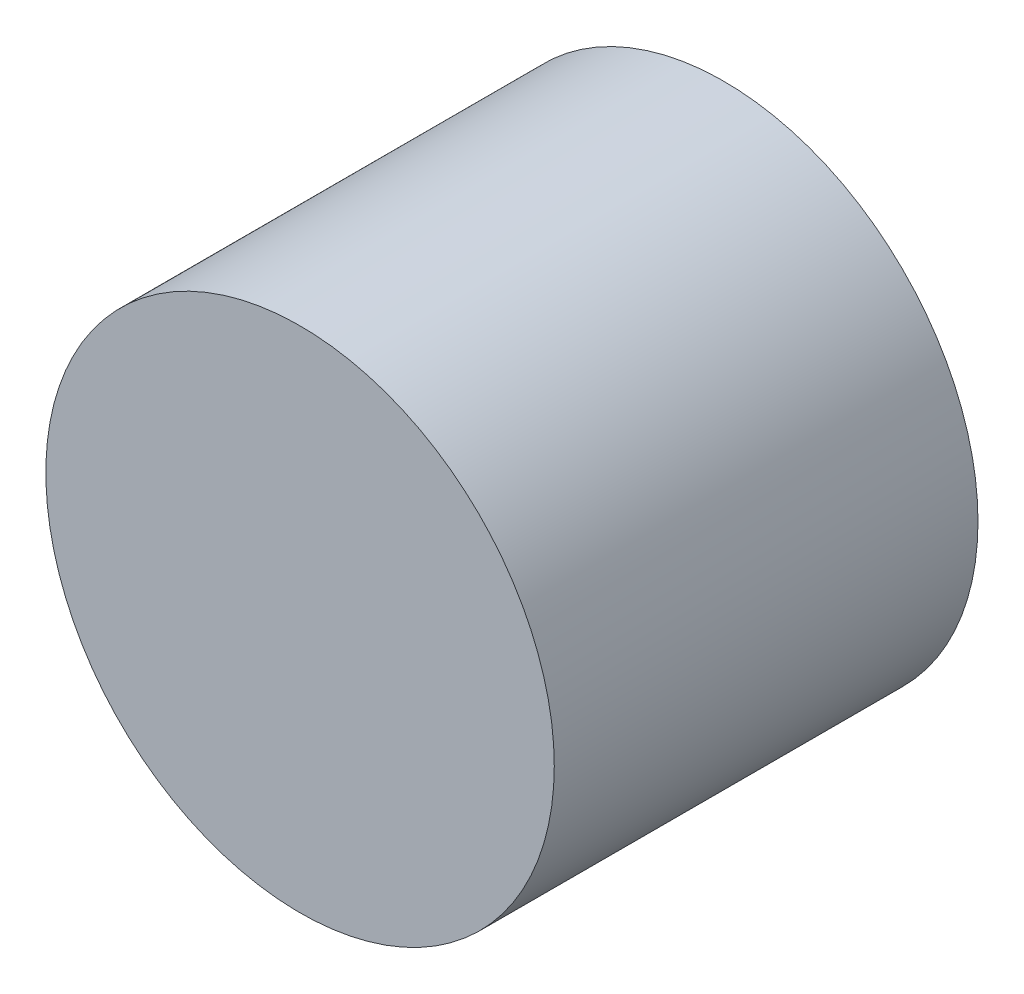
ISO-10303-21;
HEADER;
FILE_DESCRIPTION(('STEP AP214'),'2;1');
FILE_NAME('part.step','',(''),(''),'','','');
FILE_SCHEMA(('AUTOMOTIVE_DESIGN { 1 0 10303 214 1 1 1 1 }'));
ENDSEC;
DATA;
#1=APPLICATION_CONTEXT('core data for automotive mechanical design processes');
#2=APPLICATION_PROTOCOL_DEFINITION('international standard','automotive_design',2000,#1);
#3=PRODUCT_CONTEXT('',#1,'mechanical');
#4=PRODUCT('Part','Part','',(#3));
#5=PRODUCT_RELATED_PRODUCT_CATEGORY('part','',(#4));
#6=PRODUCT_DEFINITION_FORMATION('','',#4);
#7=PRODUCT_DEFINITION_CONTEXT('part definition',#1,'design');
#8=PRODUCT_DEFINITION('design','',#6,#7);
#9=PRODUCT_DEFINITION_SHAPE('','',#8);
#10=(LENGTH_UNIT() NAMED_UNIT(*) SI_UNIT(.MILLI.,.METRE.));
#11=(NAMED_UNIT(*) PLANE_ANGLE_UNIT() SI_UNIT($,.RADIAN.));
#12=(NAMED_UNIT(*) SI_UNIT($,.STERADIAN.) SOLID_ANGLE_UNIT());
#13=UNCERTAINTY_MEASURE_WITH_UNIT(LENGTH_MEASURE(1.E-05),#10,'distance_accuracy_value','');
#14=(GEOMETRIC_REPRESENTATION_CONTEXT(3) GLOBAL_UNCERTAINTY_ASSIGNED_CONTEXT((#13)) GLOBAL_UNIT_ASSIGNED_CONTEXT((#10,
#11,#12)) REPRESENTATION_CONTEXT('',''));
#15=CARTESIAN_POINT('',(0.,0.,0.));
#16=DIRECTION('',(0.,0.,1.));
#17=DIRECTION('',(1.,0.,0.));
#18=AXIS2_PLACEMENT_3D('',#15,#16,#17);
#19=CARTESIAN_POINT('',(0.,0.,7.5));
#20=DIRECTION('',(0.,0.,-1.));
#21=DIRECTION('',(-1.,0.,0.));
#22=AXIS2_PLACEMENT_3D('',#19,#20,#21);
#23=CYLINDRICAL_SURFACE('',#22,4.5);
#24=CARTESIAN_POINT('',(0.,0.,7.5));
#25=DIRECTION('',(0.,0.,1.));
#26=DIRECTION('',(1.,0.,0.));
#27=AXIS2_PLACEMENT_3D('',#24,#25,#26);
#28=CIRCLE('',#27,4.5);
#29=CARTESIAN_POINT('',(4.5,0.,7.5));
#30=VERTEX_POINT('',#29);
#31=EDGE_CURVE('E10',#30,#30,#28,.T.);
#32=ORIENTED_EDGE('',*,*,#31,.F.);
#33=EDGE_LOOP('',(#32));
#34=FACE_BOUND('',#33,.T.);
#35=CARTESIAN_POINT('',(0.,0.,0.));
#36=DIRECTION('',(0.,0.,1.));
#37=DIRECTION('',(1.,0.,0.));
#38=AXIS2_PLACEMENT_3D('',#35,#36,#37);
#39=CIRCLE('',#38,4.5);
#40=CARTESIAN_POINT('',(4.5,0.,0.));
#41=VERTEX_POINT('',#40);
#42=EDGE_CURVE('E40',#41,#41,#39,.T.);
#43=ORIENTED_EDGE('',*,*,#42,.T.);
#44=EDGE_LOOP('',(#43));
#45=FACE_BOUND('',#44,.T.);
#46=ADVANCED_FACE('F37',(#34,#45),#23,.T.);
#47=CARTESIAN_POINT('',(0.,0.,7.5));
#48=DIRECTION('',(0.,0.,1.));
#49=DIRECTION('',(1.,0.,0.));
#50=AXIS2_PLACEMENT_3D('',#47,#48,#49);
#51=PLANE('',#50);
#52=ORIENTED_EDGE('',*,*,#31,.T.);
#53=EDGE_LOOP('',(#52));
#54=FACE_BOUND('',#53,.T.);
#55=ADVANCED_FACE('F52',(#54),#51,.T.);
#56=CARTESIAN_POINT('',(0.,0.,0.));
#57=DIRECTION('',(0.,0.,1.));
#58=DIRECTION('',(1.,0.,0.));
#59=AXIS2_PLACEMENT_3D('',#56,#57,#58);
#60=PLANE('',#59);
#61=ORIENTED_EDGE('',*,*,#42,.F.);
#62=EDGE_LOOP('',(#61));
#63=FACE_BOUND('',#62,.T.);
#64=ADVANCED_FACE('F50',(#63),#60,.F.);
#65=CLOSED_SHELL('',(#46,#55,#64));
#66=MANIFOLD_SOLID_BREP('B2',#65);
#67=ADVANCED_BREP_SHAPE_REPRESENTATION('',(#18,#66),#14);
#68=SHAPE_DEFINITION_REPRESENTATION(#9,#67);
ENDSEC;
END-ISO-10303-21;
